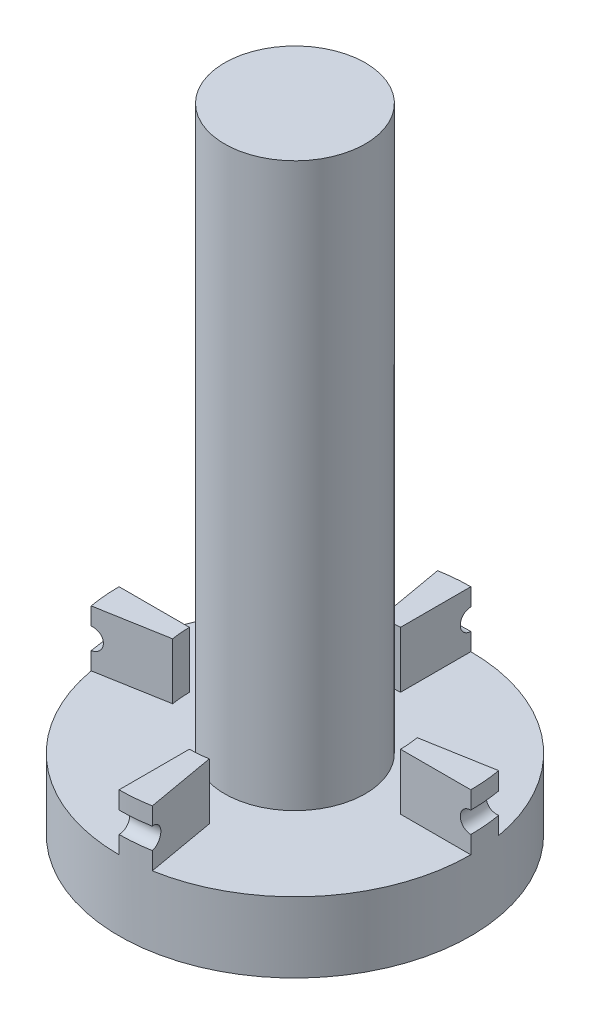
ISO-10303-21;
HEADER;
FILE_DESCRIPTION(('STEP AP214'),'2;1');
FILE_NAME('part.step','',(''),(''),'','','');
FILE_SCHEMA(('AUTOMOTIVE_DESIGN { 1 0 10303 214 1 1 1 1 }'));
ENDSEC;
DATA;
#1=APPLICATION_CONTEXT('core data for automotive mechanical design processes');
#2=APPLICATION_PROTOCOL_DEFINITION('international standard','automotive_design',2000,#1);
#3=PRODUCT_CONTEXT('',#1,'mechanical');
#4=PRODUCT('Part','Part','',(#3));
#5=PRODUCT_RELATED_PRODUCT_CATEGORY('part','',(#4));
#6=PRODUCT_DEFINITION_FORMATION('','',#4);
#7=PRODUCT_DEFINITION_CONTEXT('part definition',#1,'design');
#8=PRODUCT_DEFINITION('design','',#6,#7);
#9=PRODUCT_DEFINITION_SHAPE('','',#8);
#10=(LENGTH_UNIT() NAMED_UNIT(*) SI_UNIT(.MILLI.,.METRE.));
#11=(NAMED_UNIT(*) PLANE_ANGLE_UNIT() SI_UNIT($,.RADIAN.));
#12=(NAMED_UNIT(*) SI_UNIT($,.STERADIAN.) SOLID_ANGLE_UNIT());
#13=UNCERTAINTY_MEASURE_WITH_UNIT(LENGTH_MEASURE(1.E-05),#10,'distance_accuracy_value','');
#14=(GEOMETRIC_REPRESENTATION_CONTEXT(3) GLOBAL_UNCERTAINTY_ASSIGNED_CONTEXT((#13)) GLOBAL_UNIT_ASSIGNED_CONTEXT((#10,
#11,#12)) REPRESENTATION_CONTEXT('',''));
#15=CARTESIAN_POINT('',(0.,0.,0.));
#16=DIRECTION('',(0.,0.,1.));
#17=DIRECTION('',(1.,0.,0.));
#18=AXIS2_PLACEMENT_3D('',#15,#16,#17);
#19=CARTESIAN_POINT('',(0.,5.,0.));
#20=DIRECTION('',(0.,-1.,0.));
#21=DIRECTION('',(0.,0.,-1.));
#22=AXIS2_PLACEMENT_3D('',#19,#20,#21);
#23=PLANE('',#22);
#24=CARTESIAN_POINT('',(0.,5.,0.));
#25=DIRECTION('',(0.,-1.,0.));
#26=DIRECTION('',(0.,0.,-1.));
#27=AXIS2_PLACEMENT_3D('',#24,#25,#26);
#28=CIRCLE('',#27,5.);
#29=CARTESIAN_POINT('',(0.,5.,-5.));
#30=VERTEX_POINT('',#29);
#31=EDGE_CURVE('E11',#30,#30,#28,.T.);
#32=ORIENTED_EDGE('',*,*,#31,.T.);
#33=EDGE_LOOP('',(#32));
#34=FACE_BOUND('',#33,.T.);
#35=DIRECTION('',(-0.984807753012206,0.,0.173648177666941));
#36=VECTOR('',#35,1.);
#37=CARTESIAN_POINT('',(0.,5.,0.));
#38=LINE('',#37,#36);
#39=CARTESIAN_POINT('',(12.3100969126526,5.,-2.17060222083676));
#40=VERTEX_POINT('',#39);
#41=CARTESIAN_POINT('',(7.38605814759155,5.,-1.30236133250206));
#42=VERTEX_POINT('',#41);
#43=EDGE_CURVE('E238',#40,#42,#38,.T.);
#44=ORIENTED_EDGE('',*,*,#43,.F.);
#45=CARTESIAN_POINT('',(0.,5.,0.));
#46=DIRECTION('',(0.,-1.,0.));
#47=DIRECTION('',(0.,0.,-1.));
#48=AXIS2_PLACEMENT_3D('',#45,#46,#47);
#49=CIRCLE('',#48,12.5);
#50=CARTESIAN_POINT('',(0.,5.,-12.5));
#51=VERTEX_POINT('',#50);
#52=EDGE_CURVE('E388',#51,#40,#49,.T.);
#53=ORIENTED_EDGE('',*,*,#52,.F.);
#54=DIRECTION('',(0.,0.,1.));
#55=VECTOR('',#54,1.);
#56=CARTESIAN_POINT('',(0.,5.,0.));
#57=LINE('',#56,#55);
#58=CARTESIAN_POINT('',(0.,5.,-7.5));
#59=VERTEX_POINT('',#58);
#60=EDGE_CURVE('E352',#51,#59,#57,.T.);
#61=ORIENTED_EDGE('',*,*,#60,.T.);
#62=CARTESIAN_POINT('',(0.,5.,0.));
#63=DIRECTION('',(0.,-1.,0.));
#64=DIRECTION('',(0.,0.,-1.));
#65=AXIS2_PLACEMENT_3D('',#62,#63,#64);
#66=CIRCLE('',#65,7.5);
#67=CARTESIAN_POINT('',(-1.30236133250198,5.,-7.38605814759156));
#68=VERTEX_POINT('',#67);
#69=EDGE_CURVE('E378',#68,#59,#66,.T.);
#70=ORIENTED_EDGE('',*,*,#69,.F.);
#71=DIRECTION('',(0.173648177666931,0.,0.984807753012208));
#72=VECTOR('',#71,1.);
#73=CARTESIAN_POINT('',(0.,5.,0.));
#74=LINE('',#73,#72);
#75=CARTESIAN_POINT('',(-2.17060222083663,5.,-12.3100969126526));
#76=VERTEX_POINT('',#75);
#77=EDGE_CURVE('E370',#76,#68,#74,.T.);
#78=ORIENTED_EDGE('',*,*,#77,.F.);
#79=CARTESIAN_POINT('',(-12.5,5.,0.));
#80=VERTEX_POINT('',#79);
#81=EDGE_CURVE('E392',#80,#76,#49,.T.);
#82=ORIENTED_EDGE('',*,*,#81,.F.);
#83=DIRECTION('',(1.,0.,0.));
#84=VECTOR('',#83,1.);
#85=CARTESIAN_POINT('',(0.,5.,0.));
#86=LINE('',#85,#84);
#87=CARTESIAN_POINT('',(-7.5,5.,0.));
#88=VERTEX_POINT('',#87);
#89=EDGE_CURVE('E306',#80,#88,#86,.T.);
#90=ORIENTED_EDGE('',*,*,#89,.T.);
#91=CARTESIAN_POINT('',(0.,5.,0.));
#92=DIRECTION('',(0.,-1.,0.));
#93=DIRECTION('',(-1.,0.,0.));
#94=AXIS2_PLACEMENT_3D('',#91,#92,#93);
#95=CIRCLE('',#94,7.5);
#96=CARTESIAN_POINT('',(-7.38605814759156,5.,1.30236133250201));
#97=VERTEX_POINT('',#96);
#98=EDGE_CURVE('E332',#97,#88,#95,.T.);
#99=ORIENTED_EDGE('',*,*,#98,.F.);
#100=DIRECTION('',(0.984807753012207,0.,-0.173648177666934));
#101=VECTOR('',#100,1.);
#102=CARTESIAN_POINT('',(0.,5.,0.));
#103=LINE('',#102,#101);
#104=CARTESIAN_POINT('',(-12.3100969126526,5.,2.17060222083668));
#105=VERTEX_POINT('',#104);
#106=EDGE_CURVE('E324',#105,#97,#103,.T.);
#107=ORIENTED_EDGE('',*,*,#106,.F.);
#108=CARTESIAN_POINT('',(0.,5.,12.5));
#109=VERTEX_POINT('',#108);
#110=EDGE_CURVE('E429',#109,#105,#49,.T.);
#111=ORIENTED_EDGE('',*,*,#110,.F.);
#112=DIRECTION('',(0.,0.,-1.));
#113=VECTOR('',#112,1.);
#114=CARTESIAN_POINT('',(0.,5.,0.));
#115=LINE('',#114,#113);
#116=CARTESIAN_POINT('',(0.,5.,7.5));
#117=VERTEX_POINT('',#116);
#118=EDGE_CURVE('E262',#109,#117,#115,.T.);
#119=ORIENTED_EDGE('',*,*,#118,.T.);
#120=CARTESIAN_POINT('',(0.,5.,0.));
#121=DIRECTION('',(0.,-1.,0.));
#122=DIRECTION('',(0.,0.,1.));
#123=AXIS2_PLACEMENT_3D('',#120,#121,#122);
#124=CIRCLE('',#123,7.5);
#125=CARTESIAN_POINT('',(1.30236133250198,5.,7.38605814759156));
#126=VERTEX_POINT('',#125);
#127=EDGE_CURVE('E286',#126,#117,#124,.T.);
#128=ORIENTED_EDGE('',*,*,#127,.F.);
#129=DIRECTION('',(-0.173648177666931,0.,-0.984807753012208));
#130=VECTOR('',#129,1.);
#131=CARTESIAN_POINT('',(0.,5.,0.));
#132=LINE('',#131,#130);
#133=CARTESIAN_POINT('',(2.17060222083663,5.,12.3100969126526));
#134=VERTEX_POINT('',#133);
#135=EDGE_CURVE('E278',#134,#126,#132,.T.);
#136=ORIENTED_EDGE('',*,*,#135,.F.);
#137=CARTESIAN_POINT('',(12.5,5.,-1.30930550206618E-13));
#138=VERTEX_POINT('',#137);
#139=EDGE_CURVE('E391',#138,#134,#49,.T.);
#140=ORIENTED_EDGE('',*,*,#139,.F.);
#141=DIRECTION('',(-1.,0.,0.));
#142=VECTOR('',#141,1.);
#143=CARTESIAN_POINT('',(0.,5.,0.));
#144=LINE('',#143,#142);
#145=CARTESIAN_POINT('',(7.5,5.,0.));
#146=VERTEX_POINT('',#145);
#147=EDGE_CURVE('E225',#138,#146,#144,.T.);
#148=ORIENTED_EDGE('',*,*,#147,.T.);
#149=CARTESIAN_POINT('',(0.,5.,0.));
#150=DIRECTION('',(0.,-1.,0.));
#151=DIRECTION('',(1.,0.,0.));
#152=AXIS2_PLACEMENT_3D('',#149,#150,#151);
#153=CIRCLE('',#152,7.5);
#154=EDGE_CURVE('E246',#42,#146,#153,.T.);
#155=ORIENTED_EDGE('',*,*,#154,.F.);
#156=EDGE_LOOP('',(#44,#53,#61,#70,#78,#82,#90,#99,#107,#111,#119,#128,#136,#140,#148,#155));
#157=FACE_BOUND('',#156,.T.);
#158=ADVANCED_FACE('F35',(#34,#157),#23,.F.);
#159=CARTESIAN_POINT('',(0.,45.,0.));
#160=DIRECTION('',(0.,-1.,0.));
#161=DIRECTION('',(0.,0.,-1.));
#162=AXIS2_PLACEMENT_3D('',#159,#160,#161);
#163=CYLINDRICAL_SURFACE('',#162,5.);
#164=CARTESIAN_POINT('',(0.,45.,0.));
#165=DIRECTION('',(0.,1.,0.));
#166=DIRECTION('',(0.,0.,1.));
#167=AXIS2_PLACEMENT_3D('',#164,#165,#166);
#168=CIRCLE('',#167,5.);
#169=CARTESIAN_POINT('',(0.,45.,-5.));
#170=VERTEX_POINT('',#169);
#171=EDGE_CURVE('E43',#170,#170,#168,.T.);
#172=CARTESIAN_POINT('',(0.,45.,-5.));
#173=CARTESIAN_POINT('',(0.,44.5833333333333,-5.));
#174=CARTESIAN_POINT('',(0.,44.1666666666667,-5.));
#175=CARTESIAN_POINT('',(0.,43.3333333333333,-5.));
#176=CARTESIAN_POINT('',(0.,42.9166666666667,-5.));
#177=CARTESIAN_POINT('',(0.,42.0833333333333,-5.));
#178=CARTESIAN_POINT('',(0.,41.6666666666667,-5.));
#179=CARTESIAN_POINT('',(0.,40.8333333333333,-5.));
#180=CARTESIAN_POINT('',(0.,40.4166666666667,-5.));
#181=CARTESIAN_POINT('',(0.,39.5833333333333,-5.));
#182=CARTESIAN_POINT('',(0.,39.1666666666667,-5.));
#183=CARTESIAN_POINT('',(0.,38.3333333333333,-5.));
#184=CARTESIAN_POINT('',(0.,37.9166666666667,-5.));
#185=CARTESIAN_POINT('',(0.,37.0833333333333,-5.));
#186=CARTESIAN_POINT('',(0.,36.6666666666667,-5.));
#187=CARTESIAN_POINT('',(0.,35.8333333333333,-5.));
#188=CARTESIAN_POINT('',(0.,35.4166666666667,-5.));
#189=CARTESIAN_POINT('',(0.,34.5833333333333,-5.));
#190=CARTESIAN_POINT('',(0.,34.1666666666667,-5.));
#191=CARTESIAN_POINT('',(0.,33.3333333333333,-5.));
#192=CARTESIAN_POINT('',(0.,32.9166666666667,-5.));
#193=CARTESIAN_POINT('',(0.,32.0833333333333,-5.));
#194=CARTESIAN_POINT('',(0.,31.6666666666667,-5.));
#195=CARTESIAN_POINT('',(0.,30.8333333333333,-5.));
#196=CARTESIAN_POINT('',(0.,30.4166666666667,-5.));
#197=CARTESIAN_POINT('',(0.,29.5833333333333,-5.));
#198=CARTESIAN_POINT('',(0.,29.1666666666667,-5.));
#199=CARTESIAN_POINT('',(0.,28.3333333333333,-5.));
#200=CARTESIAN_POINT('',(0.,27.9166666666667,-5.));
#201=CARTESIAN_POINT('',(0.,27.0833333333333,-5.));
#202=CARTESIAN_POINT('',(0.,26.6666666666667,-5.));
#203=CARTESIAN_POINT('',(0.,25.8333333333333,-5.));
#204=CARTESIAN_POINT('',(0.,25.4166666666667,-5.));
#205=CARTESIAN_POINT('',(0.,24.5833333333333,-5.));
#206=CARTESIAN_POINT('',(0.,24.1666666666667,-5.));
#207=CARTESIAN_POINT('',(0.,23.3333333333333,-5.));
#208=CARTESIAN_POINT('',(0.,22.9166666666667,-5.));
#209=CARTESIAN_POINT('',(0.,22.0833333333333,-5.));
#210=CARTESIAN_POINT('',(0.,21.6666666666667,-5.));
#211=CARTESIAN_POINT('',(0.,20.8333333333333,-5.));
#212=CARTESIAN_POINT('',(0.,20.4166666666667,-5.));
#213=CARTESIAN_POINT('',(0.,19.5833333333333,-5.));
#214=CARTESIAN_POINT('',(0.,19.1666666666667,-5.));
#215=CARTESIAN_POINT('',(0.,18.3333333333333,-5.));
#216=CARTESIAN_POINT('',(0.,17.9166666666667,-5.));
#217=CARTESIAN_POINT('',(0.,17.0833333333333,-5.));
#218=CARTESIAN_POINT('',(0.,16.6666666666667,-5.));
#219=CARTESIAN_POINT('',(0.,15.8333333333333,-5.));
#220=CARTESIAN_POINT('',(0.,15.4166666666667,-5.));
#221=CARTESIAN_POINT('',(0.,14.5833333333333,-5.));
#222=CARTESIAN_POINT('',(0.,14.1666666666667,-5.));
#223=CARTESIAN_POINT('',(0.,13.3333333333333,-5.));
#224=CARTESIAN_POINT('',(0.,12.9166666666667,-5.));
#225=CARTESIAN_POINT('',(0.,12.0833333333333,-5.));
#226=CARTESIAN_POINT('',(0.,11.6666666666667,-5.));
#227=CARTESIAN_POINT('',(0.,10.8333333333333,-5.));
#228=CARTESIAN_POINT('',(0.,10.4166666666667,-5.));
#229=CARTESIAN_POINT('',(0.,9.58333333333333,-5.));
#230=CARTESIAN_POINT('',(0.,9.16666666666667,-5.));
#231=CARTESIAN_POINT('',(0.,8.33333333333333,-5.));
#232=CARTESIAN_POINT('',(0.,7.91666666666667,-5.));
#233=CARTESIAN_POINT('',(0.,7.08333333333333,-5.));
#234=CARTESIAN_POINT('',(0.,6.66666666666667,-5.));
#235=CARTESIAN_POINT('',(0.,5.83333333333333,-5.));
#236=CARTESIAN_POINT('',(0.,5.41666666666667,-5.));
#237=CARTESIAN_POINT('',(0.,5.,-5.));
#238=B_SPLINE_CURVE_WITH_KNOTS('',3,(#172,#173,#174,#175,#176,#177,#178,#179,#180,#181,#182,
#183,#184,#185,#186,#187,#188,#189,#190,#191,#192,#193,#194,#195,#196,#197,#198,#199,#200,#201,
#202,#203,#204,#205,#206,#207,#208,#209,#210,#211,#212,#213,#214,#215,#216,#217,#218,#219,#220,
#221,#222,#223,#224,#225,#226,#227,#228,#229,#230,#231,#232,#233,#234,#235,#236,#237),
.UNSPECIFIED.,.F.,.F.,(4,2,2,2,2,2,2,2,2,2,2,2,2,2,2,2,2,2,2,2,2,2,2,2,2,2,2,2,2,2,2,2,4),(0.,
1.25,2.5,3.75,5.,6.25000000000001,7.50000000000001,8.75,10.,11.25,12.5,13.75,15.,16.25,17.5,
18.75,20.,21.25,22.5,23.75,25.,26.25,27.5,28.75,30.,31.25,32.5,33.75,35.,36.25,37.5,38.75,40.),.UNSPECIFIED.);
#239=EDGE_CURVE('BSEAM37',#170,#30,#238,.T.);
#240=ORIENTED_EDGE('',*,*,#171,.F.);
#241=ORIENTED_EDGE('',*,*,#31,.F.);
#242=ORIENTED_EDGE('',*,*,#239,.T.);
#243=ORIENTED_EDGE('',*,*,#239,.F.);
#244=EDGE_LOOP('',(#240,#242,#241,#243));
#245=FACE_BOUND('',#244,.T.);
#246=ADVANCED_FACE('F37',(#245),#163,.T.);
#247=CARTESIAN_POINT('',(0.,45.,0.));
#248=DIRECTION('',(0.,1.,0.));
#249=DIRECTION('',(0.,0.,1.));
#250=AXIS2_PLACEMENT_3D('',#247,#248,#249);
#251=PLANE('',#250);
#252=ORIENTED_EDGE('',*,*,#171,.T.);
#253=EDGE_LOOP('',(#252));
#254=FACE_BOUND('',#253,.T.);
#255=ADVANCED_FACE('F397',(#254),#251,.T.);
#256=CARTESIAN_POINT('',(0.,5.,0.));
#257=DIRECTION('',(0.,-1.,0.));
#258=DIRECTION('',(0.,0.,-1.));
#259=AXIS2_PLACEMENT_3D('',#256,#257,#258);
#260=CYLINDRICAL_SURFACE('',#259,12.5);
#261=ORIENTED_EDGE('',*,*,#52,.T.);
#262=DIRECTION('',(0.,1.,0.));
#263=VECTOR('',#262,1.);
#264=CARTESIAN_POINT('',(12.3100969126526,0.,-2.17060222083676));
#265=LINE('',#264,#263);
#266=CARTESIAN_POINT('',(12.3100969126526,6.25,-2.17060222083676));
#267=VERTEX_POINT('',#266);
#268=EDGE_CURVE('E241',#40,#267,#265,.T.);
#269=ORIENTED_EDGE('',*,*,#268,.T.);
#270=CARTESIAN_POINT('',(0.,6.25000000000001,0.));
#271=DIRECTION('',(0.,-1.,0.));
#272=DIRECTION('',(1.,0.,0.));
#273=AXIS2_PLACEMENT_3D('',#270,#271,#272);
#274=CIRCLE('',#273,12.5);
#275=CARTESIAN_POINT('',(12.5,6.25,-1.30930550206618E-13));
#276=VERTEX_POINT('',#275);
#277=EDGE_CURVE('E244',#267,#276,#274,.T.);
#278=ORIENTED_EDGE('',*,*,#277,.T.);
#279=DIRECTION('',(0.,1.,0.));
#280=VECTOR('',#279,1.);
#281=CARTESIAN_POINT('',(12.5,0.,-1.30930550206618E-13));
#282=LINE('',#281,#280);
#283=EDGE_CURVE('E50',#138,#276,#282,.T.);
#284=ORIENTED_EDGE('',*,*,#283,.F.);
#285=ORIENTED_EDGE('',*,*,#139,.T.);
#286=DIRECTION('',(0.,1.,0.));
#287=VECTOR('',#286,1.);
#288=CARTESIAN_POINT('',(2.17060222083663,0.,12.3100969126526));
#289=LINE('',#288,#287);
#290=CARTESIAN_POINT('',(2.17060222083663,6.25,12.3100969126526));
#291=VERTEX_POINT('',#290);
#292=EDGE_CURVE('E281',#134,#291,#289,.T.);
#293=ORIENTED_EDGE('',*,*,#292,.T.);
#294=CARTESIAN_POINT('',(0.,6.25000000000001,0.));
#295=DIRECTION('',(0.,-1.,0.));
#296=DIRECTION('',(0.,0.,1.));
#297=AXIS2_PLACEMENT_3D('',#294,#295,#296);
#298=CIRCLE('',#297,12.5);
#299=CARTESIAN_POINT('',(0.,6.25,12.5));
#300=VERTEX_POINT('',#299);
#301=EDGE_CURVE('E284',#291,#300,#298,.T.);
#302=ORIENTED_EDGE('',*,*,#301,.T.);
#303=DIRECTION('',(0.,1.,0.));
#304=VECTOR('',#303,1.);
#305=CARTESIAN_POINT('',(0.,0.,12.5));
#306=LINE('',#305,#304);
#307=EDGE_CURVE('E57',#109,#300,#306,.T.);
#308=ORIENTED_EDGE('',*,*,#307,.F.);
#309=ORIENTED_EDGE('',*,*,#110,.T.);
#310=DIRECTION('',(0.,1.,0.));
#311=VECTOR('',#310,1.);
#312=CARTESIAN_POINT('',(-12.3100969126526,0.,2.17060222083668));
#313=LINE('',#312,#311);
#314=CARTESIAN_POINT('',(-12.3100969126526,6.25,2.17060222083668));
#315=VERTEX_POINT('',#314);
#316=EDGE_CURVE('E327',#105,#315,#313,.T.);
#317=ORIENTED_EDGE('',*,*,#316,.T.);
#318=CARTESIAN_POINT('',(0.,6.25000000000001,0.));
#319=DIRECTION('',(0.,-1.,0.));
#320=DIRECTION('',(-1.,0.,0.));
#321=AXIS2_PLACEMENT_3D('',#318,#319,#320);
#322=CIRCLE('',#321,12.5);
#323=CARTESIAN_POINT('',(-12.5,6.25,0.));
#324=VERTEX_POINT('',#323);
#325=EDGE_CURVE('E330',#315,#324,#322,.T.);
#326=ORIENTED_EDGE('',*,*,#325,.T.);
#327=DIRECTION('',(0.,1.,0.));
#328=VECTOR('',#327,1.);
#329=CARTESIAN_POINT('',(-12.5,0.,0.));
#330=LINE('',#329,#328);
#331=EDGE_CURVE('E309',#80,#324,#330,.T.);
#332=ORIENTED_EDGE('',*,*,#331,.F.);
#333=ORIENTED_EDGE('',*,*,#81,.T.);
#334=DIRECTION('',(0.,1.,0.));
#335=VECTOR('',#334,1.);
#336=CARTESIAN_POINT('',(-2.17060222083663,0.,-12.3100969126526));
#337=LINE('',#336,#335);
#338=CARTESIAN_POINT('',(-2.17060222083663,6.25,-12.3100969126526));
#339=VERTEX_POINT('',#338);
#340=EDGE_CURVE('E373',#76,#339,#337,.T.);
#341=ORIENTED_EDGE('',*,*,#340,.T.);
#342=CARTESIAN_POINT('',(0.,6.25000000000001,0.));
#343=DIRECTION('',(0.,-1.,0.));
#344=DIRECTION('',(0.,0.,-1.));
#345=AXIS2_PLACEMENT_3D('',#342,#343,#344);
#346=CIRCLE('',#345,12.5);
#347=CARTESIAN_POINT('',(0.,6.25,-12.5));
#348=VERTEX_POINT('',#347);
#349=EDGE_CURVE('E376',#339,#348,#346,.T.);
#350=ORIENTED_EDGE('',*,*,#349,.T.);
#351=DIRECTION('',(0.,1.,0.));
#352=VECTOR('',#351,1.);
#353=CARTESIAN_POINT('',(0.,0.,-12.5));
#354=LINE('',#353,#352);
#355=EDGE_CURVE('E355',#51,#348,#354,.T.);
#356=ORIENTED_EDGE('',*,*,#355,.F.);
#357=EDGE_LOOP('',(#261,#269,#278,#284,#285,#293,#302,#308,#309,#317,#326,#332,#333,#341,#350,#356));
#358=FACE_BOUND('',#357,.T.);
#359=CARTESIAN_POINT('',(0.,0.,0.));
#360=DIRECTION('',(0.,-1.,0.));
#361=DIRECTION('',(0.,0.,-1.));
#362=AXIS2_PLACEMENT_3D('',#359,#360,#361);
#363=CIRCLE('',#362,12.5);
#364=CARTESIAN_POINT('',(0.,0.,-12.5));
#365=VERTEX_POINT('',#364);
#366=EDGE_CURVE('E387',#365,#365,#363,.T.);
#367=ORIENTED_EDGE('',*,*,#366,.F.);
#368=EDGE_LOOP('',(#367));
#369=FACE_BOUND('',#368,.T.);
#370=ADVANCED_FACE('F411',(#358,#369),#260,.T.);
#371=CARTESIAN_POINT('',(0.,0.,0.));
#372=DIRECTION('',(0.,1.,0.));
#373=DIRECTION('',(0.,0.,1.));
#374=AXIS2_PLACEMENT_3D('',#371,#372,#373);
#375=PLANE('',#374);
#376=CARTESIAN_POINT('',(0.,0.,0.));
#377=DIRECTION('',(0.,-1.,0.));
#378=DIRECTION('',(0.,0.,-1.));
#379=AXIS2_PLACEMENT_3D('',#376,#377,#378);
#380=CIRCLE('',#379,2.6);
#381=CARTESIAN_POINT('',(0.,0.,-2.6));
#382=VERTEX_POINT('',#381);
#383=EDGE_CURVE('E521',#382,#382,#380,.T.);
#384=ORIENTED_EDGE('',*,*,#383,.F.);
#385=EDGE_LOOP('',(#384));
#386=FACE_BOUND('',#385,.T.);
#387=ORIENTED_EDGE('',*,*,#366,.T.);
#388=EDGE_LOOP('',(#387));
#389=FACE_BOUND('',#388,.T.);
#390=ADVANCED_FACE('F500',(#386,#389),#375,.F.);
#391=CARTESIAN_POINT('',(0.,7.,0.));
#392=DIRECTION('',(0.,-1.,0.));
#393=DIRECTION('',(0.,0.,-1.));
#394=AXIS2_PLACEMENT_3D('',#391,#392,#393);
#395=TOROIDAL_SURFACE('',#394,12.5,0.750000000000001);
#396=CARTESIAN_POINT('',(0.,7.75000000000001,0.));
#397=DIRECTION('',(0.,-1.,0.));
#398=DIRECTION('',(0.,0.,-1.));
#399=AXIS2_PLACEMENT_3D('',#396,#397,#398);
#400=CIRCLE('',#399,12.5);
#401=CARTESIAN_POINT('',(-2.17060222083663,7.75,-12.3100969126526));
#402=VERTEX_POINT('',#401);
#403=CARTESIAN_POINT('',(0.,7.75,-12.5));
#404=VERTEX_POINT('',#403);
#405=EDGE_CURVE('E385',#402,#404,#400,.T.);
#406=ORIENTED_EDGE('',*,*,#405,.T.);
#407=CARTESIAN_POINT('',(0.,7.,-12.5));
#408=DIRECTION('',(1.,0.,0.));
#409=DIRECTION('',(0.,0.,-1.));
#410=AXIS2_PLACEMENT_3D('',#407,#408,#409);
#411=CIRCLE('',#410,0.750000000000001);
#412=EDGE_CURVE('E340',#404,#348,#411,.T.);
#413=ORIENTED_EDGE('',*,*,#412,.T.);
#414=ORIENTED_EDGE('',*,*,#349,.F.);
#415=CARTESIAN_POINT('',(-2.17060222083663,7.,-12.3100969126526));
#416=DIRECTION('',(0.984807753012208,0.,-0.173648177666931));
#417=DIRECTION('',(-0.173648177666931,0.,-0.984807753012208));
#418=AXIS2_PLACEMENT_3D('',#415,#416,#417);
#419=CIRCLE('',#418,0.750000000000001);
#420=EDGE_CURVE('E358',#402,#339,#419,.T.);
#421=ORIENTED_EDGE('',*,*,#420,.F.);
#422=EDGE_LOOP('',(#406,#413,#414,#421));
#423=FACE_BOUND('',#422,.T.);
#424=ADVANCED_FACE('F496',(#423),#395,.F.);
#425=CARTESIAN_POINT('',(0.,45.,0.));
#426=DIRECTION('',(0.,-1.,0.));
#427=DIRECTION('',(0.,0.,-1.));
#428=AXIS2_PLACEMENT_3D('',#425,#426,#427);
#429=CYLINDRICAL_SURFACE('',#428,12.5);
#430=CARTESIAN_POINT('',(0.,9.,0.));
#431=DIRECTION('',(0.,-1.,0.));
#432=DIRECTION('',(0.,0.,-1.));
#433=AXIS2_PLACEMENT_3D('',#430,#431,#432);
#434=CIRCLE('',#433,12.5);
#435=CARTESIAN_POINT('',(-2.17060222083663,9.,-12.3100969126526));
#436=VERTEX_POINT('',#435);
#437=CARTESIAN_POINT('',(0.,9.,-12.5));
#438=VERTEX_POINT('',#437);
#439=EDGE_CURVE('E383',#436,#438,#434,.T.);
#440=ORIENTED_EDGE('',*,*,#439,.T.);
#441=DIRECTION('',(0.,1.,0.));
#442=VECTOR('',#441,1.);
#443=CARTESIAN_POINT('',(0.,0.,-12.5));
#444=LINE('',#443,#442);
#445=EDGE_CURVE('E343',#404,#438,#444,.T.);
#446=ORIENTED_EDGE('',*,*,#445,.F.);
#447=ORIENTED_EDGE('',*,*,#405,.F.);
#448=DIRECTION('',(0.,1.,0.));
#449=VECTOR('',#448,1.);
#450=CARTESIAN_POINT('',(-2.17060222083663,0.,-12.3100969126526));
#451=LINE('',#450,#449);
#452=EDGE_CURVE('E361',#402,#436,#451,.T.);
#453=ORIENTED_EDGE('',*,*,#452,.T.);
#454=EDGE_LOOP('',(#440,#446,#447,#453));
#455=FACE_BOUND('',#454,.T.);
#456=ADVANCED_FACE('F499',(#455),#429,.T.);
#457=CARTESIAN_POINT('',(0.,9.,0.));
#458=DIRECTION('',(0.,1.,0.));
#459=DIRECTION('',(0.,0.,1.));
#460=AXIS2_PLACEMENT_3D('',#457,#458,#459);
#461=PLANE('',#460);
#462=CARTESIAN_POINT('',(0.,8.99999999999999,0.));
#463=DIRECTION('',(0.,-1.,0.));
#464=DIRECTION('',(0.,0.,-1.));
#465=AXIS2_PLACEMENT_3D('',#462,#463,#464);
#466=CIRCLE('',#465,7.5);
#467=CARTESIAN_POINT('',(-1.30236133250198,9.,-7.38605814759156));
#468=VERTEX_POINT('',#467);
#469=CARTESIAN_POINT('',(0.,9.,-7.5));
#470=VERTEX_POINT('',#469);
#471=EDGE_CURVE('E381',#468,#470,#466,.T.);
#472=ORIENTED_EDGE('',*,*,#471,.T.);
#473=DIRECTION('',(0.,0.,1.));
#474=VECTOR('',#473,1.);
#475=CARTESIAN_POINT('',(0.,8.99999999999999,0.));
#476=LINE('',#475,#474);
#477=EDGE_CURVE('E346',#438,#470,#476,.T.);
#478=ORIENTED_EDGE('',*,*,#477,.F.);
#479=ORIENTED_EDGE('',*,*,#439,.F.);
#480=DIRECTION('',(0.173648177666931,0.,0.984807753012208));
#481=VECTOR('',#480,1.);
#482=CARTESIAN_POINT('',(0.,8.99999999999999,0.));
#483=LINE('',#482,#481);
#484=EDGE_CURVE('E364',#436,#468,#483,.T.);
#485=ORIENTED_EDGE('',*,*,#484,.T.);
#486=EDGE_LOOP('',(#472,#478,#479,#485));
#487=FACE_BOUND('',#486,.T.);
#488=ADVANCED_FACE('F504',(#487),#461,.T.);
#489=CARTESIAN_POINT('',(0.,45.,0.));
#490=DIRECTION('',(0.,-1.,0.));
#491=DIRECTION('',(0.,0.,-1.));
#492=AXIS2_PLACEMENT_3D('',#489,#490,#491);
#493=CYLINDRICAL_SURFACE('',#492,7.5);
#494=ORIENTED_EDGE('',*,*,#69,.T.);
#495=DIRECTION('',(0.,1.,0.));
#496=VECTOR('',#495,1.);
#497=CARTESIAN_POINT('',(0.,0.,-7.5));
#498=LINE('',#497,#496);
#499=EDGE_CURVE('E349',#59,#470,#498,.T.);
#500=ORIENTED_EDGE('',*,*,#499,.T.);
#501=ORIENTED_EDGE('',*,*,#471,.F.);
#502=DIRECTION('',(0.,1.,0.));
#503=VECTOR('',#502,1.);
#504=CARTESIAN_POINT('',(-1.30236133250198,0.,-7.38605814759156));
#505=LINE('',#504,#503);
#506=EDGE_CURVE('E367',#68,#468,#505,.T.);
#507=ORIENTED_EDGE('',*,*,#506,.F.);
#508=EDGE_LOOP('',(#494,#500,#501,#507));
#509=FACE_BOUND('',#508,.T.);
#510=ADVANCED_FACE('F421',(#509),#493,.F.);
#511=CARTESIAN_POINT('',(0.,0.,0.));
#512=DIRECTION('',(0.984807753012208,0.,-0.173648177666931));
#513=DIRECTION('',(-0.173648177666931,0.,-0.984807753012208));
#514=AXIS2_PLACEMENT_3D('',#511,#512,#513);
#515=PLANE('',#514);
#516=ORIENTED_EDGE('',*,*,#420,.T.);
#517=ORIENTED_EDGE('',*,*,#340,.F.);
#518=ORIENTED_EDGE('',*,*,#77,.T.);
#519=ORIENTED_EDGE('',*,*,#506,.T.);
#520=ORIENTED_EDGE('',*,*,#484,.F.);
#521=ORIENTED_EDGE('',*,*,#452,.F.);
#522=EDGE_LOOP('',(#516,#517,#518,#519,#520,#521));
#523=FACE_BOUND('',#522,.T.);
#524=ADVANCED_FACE('F425',(#523),#515,.F.);
#525=CARTESIAN_POINT('',(0.,0.,0.));
#526=DIRECTION('',(1.,0.,0.));
#527=DIRECTION('',(0.,0.,-1.));
#528=AXIS2_PLACEMENT_3D('',#525,#526,#527);
#529=PLANE('',#528);
#530=ORIENTED_EDGE('',*,*,#412,.F.);
#531=ORIENTED_EDGE('',*,*,#445,.T.);
#532=ORIENTED_EDGE('',*,*,#477,.T.);
#533=ORIENTED_EDGE('',*,*,#499,.F.);
#534=ORIENTED_EDGE('',*,*,#60,.F.);
#535=ORIENTED_EDGE('',*,*,#355,.T.);
#536=EDGE_LOOP('',(#530,#531,#532,#533,#534,#535));
#537=FACE_BOUND('',#536,.T.);
#538=ADVANCED_FACE('F415',(#537),#529,.T.);
#539=CARTESIAN_POINT('',(0.,7.,0.));
#540=DIRECTION('',(0.,-1.,0.));
#541=DIRECTION('',(-1.,0.,0.));
#542=AXIS2_PLACEMENT_3D('',#539,#540,#541);
#543=TOROIDAL_SURFACE('',#542,12.5,0.750000000000001);
#544=CARTESIAN_POINT('',(0.,7.75000000000001,0.));
#545=DIRECTION('',(0.,-1.,0.));
#546=DIRECTION('',(-1.,0.,0.));
#547=AXIS2_PLACEMENT_3D('',#544,#545,#546);
#548=CIRCLE('',#547,12.5);
#549=CARTESIAN_POINT('',(-12.3100969126526,7.75,2.17060222083668));
#550=VERTEX_POINT('',#549);
#551=CARTESIAN_POINT('',(-12.5,7.75,0.));
#552=VERTEX_POINT('',#551);
#553=EDGE_CURVE('E338',#550,#552,#548,.T.);
#554=ORIENTED_EDGE('',*,*,#553,.T.);
#555=CARTESIAN_POINT('',(-12.5,7.,0.));
#556=DIRECTION('',(0.,0.,-1.));
#557=DIRECTION('',(-1.,0.,0.));
#558=AXIS2_PLACEMENT_3D('',#555,#556,#557);
#559=CIRCLE('',#558,0.750000000000001);
#560=EDGE_CURVE('E294',#552,#324,#559,.T.);
#561=ORIENTED_EDGE('',*,*,#560,.T.);
#562=ORIENTED_EDGE('',*,*,#325,.F.);
#563=CARTESIAN_POINT('',(-12.3100969126526,7.,2.17060222083668));
#564=DIRECTION('',(-0.173648177666934,0.,-0.984807753012207));
#565=DIRECTION('',(-0.984807753012207,0.,0.173648177666934));
#566=AXIS2_PLACEMENT_3D('',#563,#564,#565);
#567=CIRCLE('',#566,0.750000000000001);
#568=EDGE_CURVE('E312',#550,#315,#567,.T.);
#569=ORIENTED_EDGE('',*,*,#568,.F.);
#570=EDGE_LOOP('',(#554,#561,#562,#569));
#571=FACE_BOUND('',#570,.T.);
#572=ADVANCED_FACE('F477',(#571),#543,.F.);
#573=CARTESIAN_POINT('',(0.,45.,0.));
#574=DIRECTION('',(0.,-1.,0.));
#575=DIRECTION('',(-1.,0.,0.));
#576=AXIS2_PLACEMENT_3D('',#573,#574,#575);
#577=CYLINDRICAL_SURFACE('',#576,12.5);
#578=CARTESIAN_POINT('',(0.,9.,0.));
#579=DIRECTION('',(0.,-1.,0.));
#580=DIRECTION('',(-1.,0.,0.));
#581=AXIS2_PLACEMENT_3D('',#578,#579,#580);
#582=CIRCLE('',#581,12.5);
#583=CARTESIAN_POINT('',(-12.3100969126526,9.,2.17060222083668));
#584=VERTEX_POINT('',#583);
#585=CARTESIAN_POINT('',(-12.5,9.,0.));
#586=VERTEX_POINT('',#585);
#587=EDGE_CURVE('E336',#584,#586,#582,.T.);
#588=ORIENTED_EDGE('',*,*,#587,.T.);
#589=DIRECTION('',(0.,1.,0.));
#590=VECTOR('',#589,1.);
#591=CARTESIAN_POINT('',(-12.5,0.,0.));
#592=LINE('',#591,#590);
#593=EDGE_CURVE('E297',#552,#586,#592,.T.);
#594=ORIENTED_EDGE('',*,*,#593,.F.);
#595=ORIENTED_EDGE('',*,*,#553,.F.);
#596=DIRECTION('',(0.,1.,0.));
#597=VECTOR('',#596,1.);
#598=CARTESIAN_POINT('',(-12.3100969126526,0.,2.17060222083668));
#599=LINE('',#598,#597);
#600=EDGE_CURVE('E315',#550,#584,#599,.T.);
#601=ORIENTED_EDGE('',*,*,#600,.T.);
#602=EDGE_LOOP('',(#588,#594,#595,#601));
#603=FACE_BOUND('',#602,.T.);
#604=ADVANCED_FACE('F480',(#603),#577,.T.);
#605=CARTESIAN_POINT('',(0.,9.,0.));
#606=DIRECTION('',(0.,1.,0.));
#607=DIRECTION('',(1.,0.,0.));
#608=AXIS2_PLACEMENT_3D('',#605,#606,#607);
#609=PLANE('',#608);
#610=CARTESIAN_POINT('',(0.,8.99999999999999,0.));
#611=DIRECTION('',(0.,-1.,0.));
#612=DIRECTION('',(-1.,0.,0.));
#613=AXIS2_PLACEMENT_3D('',#610,#611,#612);
#614=CIRCLE('',#613,7.5);
#615=CARTESIAN_POINT('',(-7.38605814759156,9.,1.30236133250201));
#616=VERTEX_POINT('',#615);
#617=CARTESIAN_POINT('',(-7.5,9.,0.));
#618=VERTEX_POINT('',#617);
#619=EDGE_CURVE('E334',#616,#618,#614,.T.);
#620=ORIENTED_EDGE('',*,*,#619,.T.);
#621=DIRECTION('',(1.,0.,0.));
#622=VECTOR('',#621,1.);
#623=CARTESIAN_POINT('',(0.,8.99999999999999,0.));
#624=LINE('',#623,#622);
#625=EDGE_CURVE('E300',#586,#618,#624,.T.);
#626=ORIENTED_EDGE('',*,*,#625,.F.);
#627=ORIENTED_EDGE('',*,*,#587,.F.);
#628=DIRECTION('',(0.984807753012207,0.,-0.173648177666934));
#629=VECTOR('',#628,1.);
#630=CARTESIAN_POINT('',(0.,8.99999999999999,0.));
#631=LINE('',#630,#629);
#632=EDGE_CURVE('E318',#584,#616,#631,.T.);
#633=ORIENTED_EDGE('',*,*,#632,.T.);
#634=EDGE_LOOP('',(#620,#626,#627,#633));
#635=FACE_BOUND('',#634,.T.);
#636=ADVANCED_FACE('F484',(#635),#609,.T.);
#637=CARTESIAN_POINT('',(0.,45.,0.));
#638=DIRECTION('',(0.,-1.,0.));
#639=DIRECTION('',(-1.,0.,0.));
#640=AXIS2_PLACEMENT_3D('',#637,#638,#639);
#641=CYLINDRICAL_SURFACE('',#640,7.5);
#642=ORIENTED_EDGE('',*,*,#98,.T.);
#643=DIRECTION('',(0.,1.,0.));
#644=VECTOR('',#643,1.);
#645=CARTESIAN_POINT('',(-7.5,0.,0.));
#646=LINE('',#645,#644);
#647=EDGE_CURVE('E303',#88,#618,#646,.T.);
#648=ORIENTED_EDGE('',*,*,#647,.T.);
#649=ORIENTED_EDGE('',*,*,#619,.F.);
#650=DIRECTION('',(0.,1.,0.));
#651=VECTOR('',#650,1.);
#652=CARTESIAN_POINT('',(-7.38605814759155,0.,1.30236133250201));
#653=LINE('',#652,#651);
#654=EDGE_CURVE('E321',#97,#616,#653,.T.);
#655=ORIENTED_EDGE('',*,*,#654,.F.);
#656=EDGE_LOOP('',(#642,#648,#649,#655));
#657=FACE_BOUND('',#656,.T.);
#658=ADVANCED_FACE('F475',(#657),#641,.F.);
#659=CARTESIAN_POINT('',(0.,0.,0.));
#660=DIRECTION('',(-0.173648177666934,0.,-0.984807753012207));
#661=DIRECTION('',(-0.984807753012207,0.,0.173648177666934));
#662=AXIS2_PLACEMENT_3D('',#659,#660,#661);
#663=PLANE('',#662);
#664=ORIENTED_EDGE('',*,*,#568,.T.);
#665=ORIENTED_EDGE('',*,*,#316,.F.);
#666=ORIENTED_EDGE('',*,*,#106,.T.);
#667=ORIENTED_EDGE('',*,*,#654,.T.);
#668=ORIENTED_EDGE('',*,*,#632,.F.);
#669=ORIENTED_EDGE('',*,*,#600,.F.);
#670=EDGE_LOOP('',(#664,#665,#666,#667,#668,#669));
#671=FACE_BOUND('',#670,.T.);
#672=ADVANCED_FACE('F463',(#671),#663,.F.);
#673=CARTESIAN_POINT('',(0.,0.,0.));
#674=DIRECTION('',(0.,0.,-1.));
#675=DIRECTION('',(-1.,0.,0.));
#676=AXIS2_PLACEMENT_3D('',#673,#674,#675);
#677=PLANE('',#676);
#678=ORIENTED_EDGE('',*,*,#560,.F.);
#679=ORIENTED_EDGE('',*,*,#593,.T.);
#680=ORIENTED_EDGE('',*,*,#625,.T.);
#681=ORIENTED_EDGE('',*,*,#647,.F.);
#682=ORIENTED_EDGE('',*,*,#89,.F.);
#683=ORIENTED_EDGE('',*,*,#331,.T.);
#684=EDGE_LOOP('',(#678,#679,#680,#681,#682,#683));
#685=FACE_BOUND('',#684,.T.);
#686=ADVANCED_FACE('F456',(#685),#677,.T.);
#687=CARTESIAN_POINT('',(0.,7.,0.));
#688=DIRECTION('',(0.,-1.,0.));
#689=DIRECTION('',(0.,0.,1.));
#690=AXIS2_PLACEMENT_3D('',#687,#688,#689);
#691=TOROIDAL_SURFACE('',#690,12.5,0.750000000000001);
#692=CARTESIAN_POINT('',(0.,7.75000000000001,0.));
#693=DIRECTION('',(0.,-1.,0.));
#694=DIRECTION('',(0.,0.,1.));
#695=AXIS2_PLACEMENT_3D('',#692,#693,#694);
#696=CIRCLE('',#695,12.5);
#697=CARTESIAN_POINT('',(2.17060222083663,7.75,12.3100969126526));
#698=VERTEX_POINT('',#697);
#699=CARTESIAN_POINT('',(0.,7.75,12.5));
#700=VERTEX_POINT('',#699);
#701=EDGE_CURVE('E292',#698,#700,#696,.T.);
#702=ORIENTED_EDGE('',*,*,#701,.T.);
#703=CARTESIAN_POINT('',(0.,7.,12.5));
#704=DIRECTION('',(-1.,0.,0.));
#705=DIRECTION('',(0.,0.,1.));
#706=AXIS2_PLACEMENT_3D('',#703,#704,#705);
#707=CIRCLE('',#706,0.750000000000001);
#708=EDGE_CURVE('E205',#700,#300,#707,.T.);
#709=ORIENTED_EDGE('',*,*,#708,.T.);
#710=ORIENTED_EDGE('',*,*,#301,.F.);
#711=CARTESIAN_POINT('',(2.17060222083663,7.,12.3100969126526));
#712=DIRECTION('',(-0.984807753012208,0.,0.173648177666931));
#713=DIRECTION('',(0.173648177666931,0.,0.984807753012208));
#714=AXIS2_PLACEMENT_3D('',#711,#712,#713);
#715=CIRCLE('',#714,0.750000000000001);
#716=EDGE_CURVE('E266',#698,#291,#715,.T.);
#717=ORIENTED_EDGE('',*,*,#716,.F.);
#718=EDGE_LOOP('',(#702,#709,#710,#717));
#719=FACE_BOUND('',#718,.T.);
#720=ADVANCED_FACE('F454',(#719),#691,.F.);
#721=CARTESIAN_POINT('',(0.,45.,0.));
#722=DIRECTION('',(0.,-1.,0.));
#723=DIRECTION('',(0.,0.,1.));
#724=AXIS2_PLACEMENT_3D('',#721,#722,#723);
#725=CYLINDRICAL_SURFACE('',#724,12.5);
#726=CARTESIAN_POINT('',(0.,9.,0.));
#727=DIRECTION('',(0.,-1.,0.));
#728=DIRECTION('',(0.,0.,1.));
#729=AXIS2_PLACEMENT_3D('',#726,#727,#728);
#730=CIRCLE('',#729,12.5);
#731=CARTESIAN_POINT('',(2.17060222083663,9.,12.3100969126526));
#732=VERTEX_POINT('',#731);
#733=CARTESIAN_POINT('',(0.,9.,12.5));
#734=VERTEX_POINT('',#733);
#735=EDGE_CURVE('E290',#732,#734,#730,.T.);
#736=ORIENTED_EDGE('',*,*,#735,.T.);
#737=DIRECTION('',(0.,1.,0.));
#738=VECTOR('',#737,1.);
#739=CARTESIAN_POINT('',(0.,0.,12.5));
#740=LINE('',#739,#738);
#741=EDGE_CURVE('E253',#700,#734,#740,.T.);
#742=ORIENTED_EDGE('',*,*,#741,.F.);
#743=ORIENTED_EDGE('',*,*,#701,.F.);
#744=DIRECTION('',(0.,1.,0.));
#745=VECTOR('',#744,1.);
#746=CARTESIAN_POINT('',(2.17060222083663,0.,12.3100969126526));
#747=LINE('',#746,#745);
#748=EDGE_CURVE('E269',#698,#732,#747,.T.);
#749=ORIENTED_EDGE('',*,*,#748,.T.);
#750=EDGE_LOOP('',(#736,#742,#743,#749));
#751=FACE_BOUND('',#750,.T.);
#752=ADVANCED_FACE('F452',(#751),#725,.T.);
#753=CARTESIAN_POINT('',(0.,9.,0.));
#754=DIRECTION('',(0.,1.,0.));
#755=DIRECTION('',(0.,0.,-1.));
#756=AXIS2_PLACEMENT_3D('',#753,#754,#755);
#757=PLANE('',#756);
#758=CARTESIAN_POINT('',(0.,8.99999999999999,0.));
#759=DIRECTION('',(0.,-1.,0.));
#760=DIRECTION('',(0.,0.,1.));
#761=AXIS2_PLACEMENT_3D('',#758,#759,#760);
#762=CIRCLE('',#761,7.5);
#763=CARTESIAN_POINT('',(1.30236133250198,9.,7.38605814759156));
#764=VERTEX_POINT('',#763);
#765=CARTESIAN_POINT('',(0.,9.,7.5));
#766=VERTEX_POINT('',#765);
#767=EDGE_CURVE('E288',#764,#766,#762,.T.);
#768=ORIENTED_EDGE('',*,*,#767,.T.);
#769=DIRECTION('',(0.,0.,-1.));
#770=VECTOR('',#769,1.);
#771=CARTESIAN_POINT('',(0.,8.99999999999999,0.));
#772=LINE('',#771,#770);
#773=EDGE_CURVE('E256',#734,#766,#772,.T.);
#774=ORIENTED_EDGE('',*,*,#773,.F.);
#775=ORIENTED_EDGE('',*,*,#735,.F.);
#776=DIRECTION('',(-0.173648177666931,0.,-0.984807753012208));
#777=VECTOR('',#776,1.);
#778=CARTESIAN_POINT('',(0.,8.99999999999999,0.));
#779=LINE('',#778,#777);
#780=EDGE_CURVE('E272',#732,#764,#779,.T.);
#781=ORIENTED_EDGE('',*,*,#780,.T.);
#782=EDGE_LOOP('',(#768,#774,#775,#781));
#783=FACE_BOUND('',#782,.T.);
#784=ADVANCED_FACE('F449',(#783),#757,.T.);
#785=CARTESIAN_POINT('',(0.,45.,0.));
#786=DIRECTION('',(0.,-1.,0.));
#787=DIRECTION('',(0.,0.,1.));
#788=AXIS2_PLACEMENT_3D('',#785,#786,#787);
#789=CYLINDRICAL_SURFACE('',#788,7.5);
#790=ORIENTED_EDGE('',*,*,#127,.T.);
#791=DIRECTION('',(0.,1.,0.));
#792=VECTOR('',#791,1.);
#793=CARTESIAN_POINT('',(0.,0.,7.5));
#794=LINE('',#793,#792);
#795=EDGE_CURVE('E259',#117,#766,#794,.T.);
#796=ORIENTED_EDGE('',*,*,#795,.T.);
#797=ORIENTED_EDGE('',*,*,#767,.F.);
#798=DIRECTION('',(0.,1.,0.));
#799=VECTOR('',#798,1.);
#800=CARTESIAN_POINT('',(1.30236133250198,0.,7.38605814759156));
#801=LINE('',#800,#799);
#802=EDGE_CURVE('E275',#126,#764,#801,.T.);
#803=ORIENTED_EDGE('',*,*,#802,.F.);
#804=EDGE_LOOP('',(#790,#796,#797,#803));
#805=FACE_BOUND('',#804,.T.);
#806=ADVANCED_FACE('F442',(#805),#789,.F.);
#807=CARTESIAN_POINT('',(0.,0.,0.));
#808=DIRECTION('',(-0.984807753012208,0.,0.173648177666931));
#809=DIRECTION('',(0.173648177666931,0.,0.984807753012208));
#810=AXIS2_PLACEMENT_3D('',#807,#808,#809);
#811=PLANE('',#810);
#812=ORIENTED_EDGE('',*,*,#716,.T.);
#813=ORIENTED_EDGE('',*,*,#292,.F.);
#814=ORIENTED_EDGE('',*,*,#135,.T.);
#815=ORIENTED_EDGE('',*,*,#802,.T.);
#816=ORIENTED_EDGE('',*,*,#780,.F.);
#817=ORIENTED_EDGE('',*,*,#748,.F.);
#818=EDGE_LOOP('',(#812,#813,#814,#815,#816,#817));
#819=FACE_BOUND('',#818,.T.);
#820=ADVANCED_FACE('F436',(#819),#811,.F.);
#821=CARTESIAN_POINT('',(0.,0.,0.));
#822=DIRECTION('',(-1.,0.,0.));
#823=DIRECTION('',(0.,0.,1.));
#824=AXIS2_PLACEMENT_3D('',#821,#822,#823);
#825=PLANE('',#824);
#826=ORIENTED_EDGE('',*,*,#708,.F.);
#827=ORIENTED_EDGE('',*,*,#741,.T.);
#828=ORIENTED_EDGE('',*,*,#773,.T.);
#829=ORIENTED_EDGE('',*,*,#795,.F.);
#830=ORIENTED_EDGE('',*,*,#118,.F.);
#831=ORIENTED_EDGE('',*,*,#307,.T.);
#832=EDGE_LOOP('',(#826,#827,#828,#829,#830,#831));
#833=FACE_BOUND('',#832,.T.);
#834=ADVANCED_FACE('F445',(#833),#825,.T.);
#835=CARTESIAN_POINT('',(0.,7.,0.));
#836=DIRECTION('',(0.,-1.,0.));
#837=DIRECTION('',(1.,0.,0.));
#838=AXIS2_PLACEMENT_3D('',#835,#836,#837);
#839=TOROIDAL_SURFACE('',#838,12.5,0.750000000000001);
#840=CARTESIAN_POINT('',(0.,7.75000000000001,0.));
#841=DIRECTION('',(0.,-1.,0.));
#842=DIRECTION('',(1.,0.,0.));
#843=AXIS2_PLACEMENT_3D('',#840,#841,#842);
#844=CIRCLE('',#843,12.5);
#845=CARTESIAN_POINT('',(12.3100969126526,7.75,-2.17060222083676));
#846=VERTEX_POINT('',#845);
#847=CARTESIAN_POINT('',(12.5,7.75,-1.30930550206618E-13));
#848=VERTEX_POINT('',#847);
#849=EDGE_CURVE('E195',#846,#848,#844,.T.);
#850=ORIENTED_EDGE('',*,*,#849,.T.);
#851=CARTESIAN_POINT('',(12.5,7.,-1.30930550206618E-13));
#852=DIRECTION('',(0.,0.,1.));
#853=DIRECTION('',(1.,0.,0.));
#854=AXIS2_PLACEMENT_3D('',#851,#852,#853);
#855=CIRCLE('',#854,0.750000000000001);
#856=EDGE_CURVE('E198',#848,#276,#855,.T.);
#857=ORIENTED_EDGE('',*,*,#856,.T.);
#858=ORIENTED_EDGE('',*,*,#277,.F.);
#859=CARTESIAN_POINT('',(12.3100969126526,7.,-2.17060222083676));
#860=DIRECTION('',(0.173648177666941,0.,0.984807753012206));
#861=DIRECTION('',(0.984807753012206,0.,-0.173648177666941));
#862=AXIS2_PLACEMENT_3D('',#859,#860,#861);
#863=CIRCLE('',#862,0.750000000000001);
#864=EDGE_CURVE('E200',#846,#267,#863,.T.);
#865=ORIENTED_EDGE('',*,*,#864,.F.);
#866=EDGE_LOOP('',(#850,#857,#858,#865));
#867=FACE_BOUND('',#866,.T.);
#868=ADVANCED_FACE('F197',(#867),#839,.F.);
#869=CARTESIAN_POINT('',(0.,45.,0.));
#870=DIRECTION('',(0.,-1.,0.));
#871=DIRECTION('',(1.,0.,0.));
#872=AXIS2_PLACEMENT_3D('',#869,#870,#871);
#873=CYLINDRICAL_SURFACE('',#872,12.5);
#874=CARTESIAN_POINT('',(0.,9.,0.));
#875=DIRECTION('',(0.,-1.,0.));
#876=DIRECTION('',(1.,0.,0.));
#877=AXIS2_PLACEMENT_3D('',#874,#875,#876);
#878=CIRCLE('',#877,12.5);
#879=CARTESIAN_POINT('',(12.3100969126526,9.,-2.17060222083676));
#880=VERTEX_POINT('',#879);
#881=CARTESIAN_POINT('',(12.5,9.,-1.30930550206618E-13));
#882=VERTEX_POINT('',#881);
#883=EDGE_CURVE('E206',#880,#882,#878,.T.);
#884=ORIENTED_EDGE('',*,*,#883,.T.);
#885=DIRECTION('',(0.,1.,0.));
#886=VECTOR('',#885,1.);
#887=CARTESIAN_POINT('',(12.5,0.,-1.30930550206618E-13));
#888=LINE('',#887,#886);
#889=EDGE_CURVE('E212',#848,#882,#888,.T.);
#890=ORIENTED_EDGE('',*,*,#889,.F.);
#891=ORIENTED_EDGE('',*,*,#849,.F.);
#892=DIRECTION('',(0.,1.,0.));
#893=VECTOR('',#892,1.);
#894=CARTESIAN_POINT('',(12.3100969126526,0.,-2.17060222083676));
#895=LINE('',#894,#893);
#896=EDGE_CURVE('E230',#846,#880,#895,.T.);
#897=ORIENTED_EDGE('',*,*,#896,.T.);
#898=EDGE_LOOP('',(#884,#890,#891,#897));
#899=FACE_BOUND('',#898,.T.);
#900=ADVANCED_FACE('F216',(#899),#873,.T.);
#901=CARTESIAN_POINT('',(0.,9.,0.));
#902=DIRECTION('',(0.,1.,0.));
#903=DIRECTION('',(-1.,0.,0.));
#904=AXIS2_PLACEMENT_3D('',#901,#902,#903);
#905=PLANE('',#904);
#906=CARTESIAN_POINT('',(0.,8.99999999999999,0.));
#907=DIRECTION('',(0.,-1.,0.));
#908=DIRECTION('',(1.,0.,0.));
#909=AXIS2_PLACEMENT_3D('',#906,#907,#908);
#910=CIRCLE('',#909,7.5);
#911=CARTESIAN_POINT('',(7.38605814759155,9.,-1.30236133250206));
#912=VERTEX_POINT('',#911);
#913=CARTESIAN_POINT('',(7.5,9.,0.));
#914=VERTEX_POINT('',#913);
#915=EDGE_CURVE('E248',#912,#914,#910,.T.);
#916=ORIENTED_EDGE('',*,*,#915,.T.);
#917=DIRECTION('',(-1.,0.,0.));
#918=VECTOR('',#917,1.);
#919=CARTESIAN_POINT('',(0.,8.99999999999999,0.));
#920=LINE('',#919,#918);
#921=EDGE_CURVE('E217',#882,#914,#920,.T.);
#922=ORIENTED_EDGE('',*,*,#921,.F.);
#923=ORIENTED_EDGE('',*,*,#883,.F.);
#924=DIRECTION('',(-0.984807753012206,0.,0.173648177666941));
#925=VECTOR('',#924,1.);
#926=CARTESIAN_POINT('',(0.,8.99999999999999,0.));
#927=LINE('',#926,#925);
#928=EDGE_CURVE('E232',#880,#912,#927,.T.);
#929=ORIENTED_EDGE('',*,*,#928,.T.);
#930=EDGE_LOOP('',(#916,#922,#923,#929));
#931=FACE_BOUND('',#930,.T.);
#932=ADVANCED_FACE('F548',(#931),#905,.T.);
#933=CARTESIAN_POINT('',(0.,45.,0.));
#934=DIRECTION('',(0.,-1.,0.));
#935=DIRECTION('',(1.,0.,0.));
#936=AXIS2_PLACEMENT_3D('',#933,#934,#935);
#937=CYLINDRICAL_SURFACE('',#936,7.5);
#938=ORIENTED_EDGE('',*,*,#154,.T.);
#939=DIRECTION('',(0.,1.,0.));
#940=VECTOR('',#939,1.);
#941=CARTESIAN_POINT('',(7.5,0.,0.));
#942=LINE('',#941,#940);
#943=EDGE_CURVE('E219',#146,#914,#942,.T.);
#944=ORIENTED_EDGE('',*,*,#943,.T.);
#945=ORIENTED_EDGE('',*,*,#915,.F.);
#946=DIRECTION('',(0.,1.,0.));
#947=VECTOR('',#946,1.);
#948=CARTESIAN_POINT('',(7.38605814759154,0.,-1.30236133250206));
#949=LINE('',#948,#947);
#950=EDGE_CURVE('E235',#42,#912,#949,.T.);
#951=ORIENTED_EDGE('',*,*,#950,.F.);
#952=EDGE_LOOP('',(#938,#944,#945,#951));
#953=FACE_BOUND('',#952,.T.);
#954=ADVANCED_FACE('F543',(#953),#937,.F.);
#955=CARTESIAN_POINT('',(0.,0.,0.));
#956=DIRECTION('',(0.173648177666941,0.,0.984807753012206));
#957=DIRECTION('',(0.984807753012206,0.,-0.173648177666941));
#958=AXIS2_PLACEMENT_3D('',#955,#956,#957);
#959=PLANE('',#958);
#960=ORIENTED_EDGE('',*,*,#864,.T.);
#961=ORIENTED_EDGE('',*,*,#268,.F.);
#962=ORIENTED_EDGE('',*,*,#43,.T.);
#963=ORIENTED_EDGE('',*,*,#950,.T.);
#964=ORIENTED_EDGE('',*,*,#928,.F.);
#965=ORIENTED_EDGE('',*,*,#896,.F.);
#966=EDGE_LOOP('',(#960,#961,#962,#963,#964,#965));
#967=FACE_BOUND('',#966,.T.);
#968=ADVANCED_FACE('F538',(#967),#959,.F.);
#969=CARTESIAN_POINT('',(0.,0.,0.));
#970=DIRECTION('',(0.,0.,1.));
#971=DIRECTION('',(1.,0.,0.));
#972=AXIS2_PLACEMENT_3D('',#969,#970,#971);
#973=PLANE('',#972);
#974=ORIENTED_EDGE('',*,*,#856,.F.);
#975=ORIENTED_EDGE('',*,*,#889,.T.);
#976=ORIENTED_EDGE('',*,*,#921,.T.);
#977=ORIENTED_EDGE('',*,*,#943,.F.);
#978=ORIENTED_EDGE('',*,*,#147,.F.);
#979=ORIENTED_EDGE('',*,*,#283,.T.);
#980=EDGE_LOOP('',(#974,#975,#976,#977,#978,#979));
#981=FACE_BOUND('',#980,.T.);
#982=ADVANCED_FACE('F210',(#981),#973,.T.);
#983=CARTESIAN_POINT('',(0.,11.,0.));
#984=DIRECTION('',(0.,-1.,0.));
#985=DIRECTION('',(0.,0.,-1.));
#986=AXIS2_PLACEMENT_3D('',#983,#984,#985);
#987=CYLINDRICAL_SURFACE('',#986,2.6);
#988=CARTESIAN_POINT('',(0.,11.,0.));
#989=DIRECTION('',(0.,-1.,0.));
#990=DIRECTION('',(0.,0.,-1.));
#991=AXIS2_PLACEMENT_3D('',#988,#989,#990);
#992=CIRCLE('',#991,2.6);
#993=CARTESIAN_POINT('',(0.,11.,-2.6));
#994=VERTEX_POINT('',#993);
#995=EDGE_CURVE('E214',#994,#994,#992,.T.);
#996=ORIENTED_EDGE('',*,*,#995,.F.);
#997=EDGE_LOOP('',(#996));
#998=FACE_BOUND('',#997,.T.);
#999=ORIENTED_EDGE('',*,*,#383,.T.);
#1000=EDGE_LOOP('',(#999));
#1001=FACE_BOUND('',#1000,.T.);
#1002=ADVANCED_FACE('F530',(#998,#1001),#987,.F.);
#1003=CARTESIAN_POINT('',(0.,11.,0.));
#1004=DIRECTION('',(0.,-1.,0.));
#1005=DIRECTION('',(0.,0.,-1.));
#1006=AXIS2_PLACEMENT_3D('',#1003,#1004,#1005);
#1007=PLANE('',#1006);
#1008=ORIENTED_EDGE('',*,*,#995,.T.);
#1009=EDGE_LOOP('',(#1008));
#1010=FACE_BOUND('',#1009,.T.);
#1011=ADVANCED_FACE('F528',(#1010),#1007,.T.);
#1012=CLOSED_SHELL('',(#158,#246,#255,#370,#390,#424,#456,#488,#510,#524,#538,#572,#604,#636,
#658,#672,#686,#720,#752,#784,#806,#820,#834,#868,#900,#932,#954,#968,#982,#1002,#1011));
#1013=MANIFOLD_SOLID_BREP('B2',#1012);
#1014=ADVANCED_BREP_SHAPE_REPRESENTATION('',(#18,#1013),#14);
#1015=SHAPE_DEFINITION_REPRESENTATION(#9,#1014);
ENDSEC;
END-ISO-10303-21;
